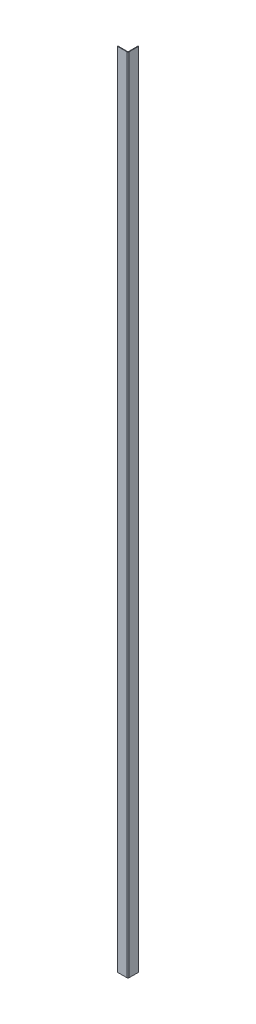
ISO-10303-21;
HEADER;
FILE_DESCRIPTION(('STEP AP214'),'2;1');
FILE_NAME('part.step','',(''),(''),'','','');
FILE_SCHEMA(('AUTOMOTIVE_DESIGN { 1 0 10303 214 1 1 1 1 }'));
ENDSEC;
DATA;
#1=APPLICATION_CONTEXT('core data for automotive mechanical design processes');
#2=APPLICATION_PROTOCOL_DEFINITION('international standard','automotive_design',2000,#1);
#3=PRODUCT_CONTEXT('',#1,'mechanical');
#4=PRODUCT('Part','Part','',(#3));
#5=PRODUCT_RELATED_PRODUCT_CATEGORY('part','',(#4));
#6=PRODUCT_DEFINITION_FORMATION('','',#4);
#7=PRODUCT_DEFINITION_CONTEXT('part definition',#1,'design');
#8=PRODUCT_DEFINITION('design','',#6,#7);
#9=PRODUCT_DEFINITION_SHAPE('','',#8);
#10=(LENGTH_UNIT() NAMED_UNIT(*) SI_UNIT(.MILLI.,.METRE.));
#11=(NAMED_UNIT(*) PLANE_ANGLE_UNIT() SI_UNIT($,.RADIAN.));
#12=(NAMED_UNIT(*) SI_UNIT($,.STERADIAN.) SOLID_ANGLE_UNIT());
#13=UNCERTAINTY_MEASURE_WITH_UNIT(LENGTH_MEASURE(1.E-05),#10,'distance_accuracy_value','');
#14=(GEOMETRIC_REPRESENTATION_CONTEXT(3) GLOBAL_UNCERTAINTY_ASSIGNED_CONTEXT((#13)) GLOBAL_UNIT_ASSIGNED_CONTEXT((#10,
#11,#12)) REPRESENTATION_CONTEXT('',''));
#15=CARTESIAN_POINT('',(0.,0.,0.));
#16=DIRECTION('',(0.,0.,1.));
#17=DIRECTION('',(1.,0.,0.));
#18=AXIS2_PLACEMENT_3D('',#15,#16,#17);
#19=CARTESIAN_POINT('',(-2.,1523.5,-20.));
#20=DIRECTION('',(0.,1.,0.));
#21=DIRECTION('',(0.,0.,1.));
#22=AXIS2_PLACEMENT_3D('',#19,#20,#21);
#23=PLANE('',#22);
#24=DIRECTION('',(0.,0.,1.));
#25=VECTOR('',#24,1.);
#26=CARTESIAN_POINT('',(-2.,1523.5,-20.));
#27=LINE('',#26,#25);
#28=CARTESIAN_POINT('',(-2.,1523.5,-20.));
#29=VERTEX_POINT('',#28);
#30=CARTESIAN_POINT('',(-1.99999999999997,1523.5,15.5));
#31=VERTEX_POINT('',#30);
#32=EDGE_CURVE('E113',#29,#31,#27,.T.);
#33=ORIENTED_EDGE('',*,*,#32,.T.);
#34=DIRECTION('',(1.,0.,0.));
#35=VECTOR('',#34,1.);
#36=CARTESIAN_POINT('',(-1.99999999999997,1523.5,15.5));
#37=LINE('',#36,#35);
#38=CARTESIAN_POINT('',(0.,1523.5,15.5));
#39=VERTEX_POINT('',#38);
#40=EDGE_CURVE('E106',#31,#39,#37,.T.);
#41=ORIENTED_EDGE('',*,*,#40,.T.);
#42=DIRECTION('',(0.,0.,1.));
#43=VECTOR('',#42,1.);
#44=CARTESIAN_POINT('',(0.,1523.5,-20.));
#45=LINE('',#44,#43);
#46=CARTESIAN_POINT('',(0.,1523.5,-20.));
#47=VERTEX_POINT('',#46);
#48=EDGE_CURVE('E99',#47,#39,#45,.T.);
#49=ORIENTED_EDGE('',*,*,#48,.F.);
#50=DIRECTION('',(1.,0.,0.));
#51=VECTOR('',#50,1.);
#52=CARTESIAN_POINT('',(-2.,1523.5,-20.));
#53=LINE('',#52,#51);
#54=EDGE_CURVE('E13',#29,#47,#53,.T.);
#55=ORIENTED_EDGE('',*,*,#54,.F.);
#56=EDGE_LOOP('',(#33,#41,#49,#55));
#57=FACE_BOUND('',#56,.T.);
#58=ADVANCED_FACE('F54',(#57),#23,.T.);
#59=CARTESIAN_POINT('',(-2.,0.,0.));
#60=DIRECTION('',(1.,0.,0.));
#61=DIRECTION('',(0.,0.,-1.));
#62=AXIS2_PLACEMENT_3D('',#59,#60,#61);
#63=PLANE('',#62);
#64=DIRECTION('',(0.,1.,0.));
#65=VECTOR('',#64,1.);
#66=CARTESIAN_POINT('',(-1.99999999999997,1523.5,15.5));
#67=LINE('',#66,#65);
#68=CARTESIAN_POINT('',(-1.99999999999997,-1523.5,15.5));
#69=VERTEX_POINT('',#68);
#70=EDGE_CURVE('E121',#31,#69,#67,.F.);
#71=ORIENTED_EDGE('',*,*,#70,.F.);
#72=ORIENTED_EDGE('',*,*,#32,.F.);
#73=DIRECTION('',(0.,1.,0.));
#74=VECTOR('',#73,1.);
#75=CARTESIAN_POINT('',(-2.,-1523.5,-20.));
#76=LINE('',#75,#74);
#77=CARTESIAN_POINT('',(-2.,-1523.5,-20.));
#78=VERTEX_POINT('',#77);
#79=EDGE_CURVE('E93',#78,#29,#76,.T.);
#80=ORIENTED_EDGE('',*,*,#79,.F.);
#81=DIRECTION('',(0.,0.,-1.));
#82=VECTOR('',#81,1.);
#83=CARTESIAN_POINT('',(-2.,-1523.5,-20.));
#84=LINE('',#83,#82);
#85=EDGE_CURVE('E107',#69,#78,#84,.T.);
#86=ORIENTED_EDGE('',*,*,#85,.F.);
#87=EDGE_LOOP('',(#71,#72,#80,#86));
#88=FACE_BOUND('',#87,.T.);
#89=ADVANCED_FACE('F222',(#88),#63,.F.);
#90=CARTESIAN_POINT('',(0.,0.,0.));
#91=DIRECTION('',(1.,0.,0.));
#92=DIRECTION('',(0.,0.,-1.));
#93=AXIS2_PLACEMENT_3D('',#90,#91,#92);
#94=PLANE('',#93);
#95=ORIENTED_EDGE('',*,*,#48,.T.);
#96=DIRECTION('',(0.,1.,0.));
#97=VECTOR('',#96,1.);
#98=CARTESIAN_POINT('',(0.,1523.5,15.5));
#99=LINE('',#98,#97);
#100=CARTESIAN_POINT('',(0.,-1523.5,15.5));
#101=VERTEX_POINT('',#100);
#102=EDGE_CURVE('E131',#39,#101,#99,.F.);
#103=ORIENTED_EDGE('',*,*,#102,.T.);
#104=DIRECTION('',(0.,0.,-1.));
#105=VECTOR('',#104,1.);
#106=CARTESIAN_POINT('',(0.,-1523.5,-20.));
#107=LINE('',#106,#105);
#108=CARTESIAN_POINT('',(0.,-1523.5,-20.));
#109=VERTEX_POINT('',#108);
#110=EDGE_CURVE('E101',#101,#109,#107,.T.);
#111=ORIENTED_EDGE('',*,*,#110,.T.);
#112=DIRECTION('',(0.,1.,0.));
#113=VECTOR('',#112,1.);
#114=CARTESIAN_POINT('',(0.,-1523.5,-20.));
#115=LINE('',#114,#113);
#116=EDGE_CURVE('E91',#109,#47,#115,.T.);
#117=ORIENTED_EDGE('',*,*,#116,.T.);
#118=EDGE_LOOP('',(#95,#103,#111,#117));
#119=FACE_BOUND('',#118,.T.);
#120=ADVANCED_FACE('F97',(#119),#94,.T.);
#121=CARTESIAN_POINT('',(-2.,-1523.5,-20.));
#122=DIRECTION('',(0.,0.,-1.));
#123=DIRECTION('',(-1.,0.,0.));
#124=AXIS2_PLACEMENT_3D('',#121,#122,#123);
#125=PLANE('',#124);
#126=ORIENTED_EDGE('',*,*,#116,.F.);
#127=DIRECTION('',(1.,0.,0.));
#128=VECTOR('',#127,1.);
#129=CARTESIAN_POINT('',(-2.,-1523.5,-20.));
#130=LINE('',#129,#128);
#131=EDGE_CURVE('E58',#78,#109,#130,.T.);
#132=ORIENTED_EDGE('',*,*,#131,.F.);
#133=ORIENTED_EDGE('',*,*,#79,.T.);
#134=ORIENTED_EDGE('',*,*,#54,.T.);
#135=EDGE_LOOP('',(#126,#132,#133,#134));
#136=FACE_BOUND('',#135,.T.);
#137=ADVANCED_FACE('F89',(#136),#125,.T.);
#138=CARTESIAN_POINT('',(-2.,-1523.5,-20.));
#139=DIRECTION('',(0.,-1.,0.));
#140=DIRECTION('',(0.,0.,-1.));
#141=AXIS2_PLACEMENT_3D('',#138,#139,#140);
#142=PLANE('',#141);
#143=DIRECTION('',(1.,0.,0.));
#144=VECTOR('',#143,1.);
#145=CARTESIAN_POINT('',(-1.99999999999997,-1523.5,15.5));
#146=LINE('',#145,#144);
#147=EDGE_CURVE('E112',#69,#101,#146,.T.);
#148=ORIENTED_EDGE('',*,*,#147,.F.);
#149=ORIENTED_EDGE('',*,*,#85,.T.);
#150=ORIENTED_EDGE('',*,*,#131,.T.);
#151=ORIENTED_EDGE('',*,*,#110,.F.);
#152=EDGE_LOOP('',(#148,#149,#150,#151));
#153=FACE_BOUND('',#152,.T.);
#154=ADVANCED_FACE('F56',(#153),#142,.T.);
#155=CARTESIAN_POINT('',(-4.49999999999997,-1523.5,15.5));
#156=DIRECTION('',(0.,-1.,0.));
#157=DIRECTION('',(0.,0.,-1.));
#158=AXIS2_PLACEMENT_3D('',#155,#156,#157);
#159=PLANE('',#158);
#160=DIRECTION('',(0.,0.,1.));
#161=VECTOR('',#160,1.);
#162=CARTESIAN_POINT('',(-4.49999999999999,-1523.5,20.0000000000001));
#163=LINE('',#162,#161);
#164=CARTESIAN_POINT('',(-4.49999999999996,-1523.5,18.));
#165=VERTEX_POINT('',#164);
#166=CARTESIAN_POINT('',(-4.49999999999996,-1523.5,20.));
#167=VERTEX_POINT('',#166);
#168=EDGE_CURVE('E134',#165,#167,#163,.T.);
#169=ORIENTED_EDGE('',*,*,#168,.F.);
#170=CARTESIAN_POINT('',(-4.49999999999997,-1523.5,15.5));
#171=DIRECTION('',(0.,1.,0.));
#172=DIRECTION('',(0.,0.,1.));
#173=AXIS2_PLACEMENT_3D('',#170,#171,#172);
#174=CIRCLE('',#173,2.5);
#175=EDGE_CURVE('E125',#69,#165,#174,.F.);
#176=ORIENTED_EDGE('',*,*,#175,.F.);
#177=ORIENTED_EDGE('',*,*,#147,.T.);
#178=CARTESIAN_POINT('',(-4.49999999999997,-1523.5,15.5));
#179=DIRECTION('',(0.,1.,0.));
#180=DIRECTION('',(0.,0.,1.));
#181=AXIS2_PLACEMENT_3D('',#178,#179,#180);
#182=CIRCLE('',#181,4.5);
#183=EDGE_CURVE('E69',#101,#167,#182,.F.);
#184=ORIENTED_EDGE('',*,*,#183,.T.);
#185=EDGE_LOOP('',(#169,#176,#177,#184));
#186=FACE_BOUND('',#185,.T.);
#187=ADVANCED_FACE('F206',(#186),#159,.T.);
#188=CARTESIAN_POINT('',(-4.49999999999997,1523.5,15.5));
#189=DIRECTION('',(0.,-1.,0.));
#190=DIRECTION('',(0.,0.,-1.));
#191=AXIS2_PLACEMENT_3D('',#188,#189,#190);
#192=PLANE('',#191);
#193=CARTESIAN_POINT('',(-4.49999999999997,1523.5,15.5));
#194=DIRECTION('',(0.,1.,0.));
#195=DIRECTION('',(0.,0.,1.));
#196=AXIS2_PLACEMENT_3D('',#193,#194,#195);
#197=CIRCLE('',#196,2.5);
#198=CARTESIAN_POINT('',(-4.49999999999996,1523.5,18.));
#199=VERTEX_POINT('',#198);
#200=EDGE_CURVE('E118',#199,#31,#197,.T.);
#201=ORIENTED_EDGE('',*,*,#200,.F.);
#202=DIRECTION('',(0.,0.,1.));
#203=VECTOR('',#202,1.);
#204=CARTESIAN_POINT('',(-4.49999999999995,1523.5,18.));
#205=LINE('',#204,#203);
#206=CARTESIAN_POINT('',(-4.49999999999995,1523.5,20.));
#207=VERTEX_POINT('',#206);
#208=EDGE_CURVE('E140',#199,#207,#205,.T.);
#209=ORIENTED_EDGE('',*,*,#208,.T.);
#210=CARTESIAN_POINT('',(-4.49999999999997,1523.5,15.5));
#211=DIRECTION('',(0.,1.,0.));
#212=DIRECTION('',(0.,0.,1.));
#213=AXIS2_PLACEMENT_3D('',#210,#211,#212);
#214=CIRCLE('',#213,4.5);
#215=EDGE_CURVE('E128',#207,#39,#214,.T.);
#216=ORIENTED_EDGE('',*,*,#215,.T.);
#217=ORIENTED_EDGE('',*,*,#40,.F.);
#218=EDGE_LOOP('',(#201,#209,#216,#217));
#219=FACE_BOUND('',#218,.T.);
#220=ADVANCED_FACE('F194',(#219),#192,.F.);
#221=CARTESIAN_POINT('',(-4.49999999999997,1523.5,15.5));
#222=DIRECTION('',(0.,1.,0.));
#223=DIRECTION('',(0.,0.,1.));
#224=AXIS2_PLACEMENT_3D('',#221,#222,#223);
#225=CYLINDRICAL_SURFACE('',#224,4.5);
#226=ORIENTED_EDGE('',*,*,#102,.F.);
#227=ORIENTED_EDGE('',*,*,#215,.F.);
#228=DIRECTION('',(0.,1.,0.));
#229=VECTOR('',#228,1.);
#230=CARTESIAN_POINT('',(-4.49999999999997,0.,20.));
#231=LINE('',#230,#229);
#232=EDGE_CURVE('E143',#167,#207,#231,.T.);
#233=ORIENTED_EDGE('',*,*,#232,.F.);
#234=ORIENTED_EDGE('',*,*,#183,.F.);
#235=EDGE_LOOP('',(#226,#227,#233,#234));
#236=FACE_BOUND('',#235,.T.);
#237=ADVANCED_FACE('F201',(#236),#225,.T.);
#238=CARTESIAN_POINT('',(-4.49999999999997,1523.5,15.5));
#239=DIRECTION('',(0.,1.,0.));
#240=DIRECTION('',(0.,0.,1.));
#241=AXIS2_PLACEMENT_3D('',#238,#239,#240);
#242=CYLINDRICAL_SURFACE('',#241,2.5);
#243=ORIENTED_EDGE('',*,*,#70,.T.);
#244=ORIENTED_EDGE('',*,*,#175,.T.);
#245=DIRECTION('',(0.,-1.,0.));
#246=VECTOR('',#245,1.);
#247=CARTESIAN_POINT('',(-4.49999999999999,-1523.5,18.));
#248=LINE('',#247,#246);
#249=EDGE_CURVE('E137',#165,#199,#248,.F.);
#250=ORIENTED_EDGE('',*,*,#249,.T.);
#251=ORIENTED_EDGE('',*,*,#200,.T.);
#252=EDGE_LOOP('',(#243,#244,#250,#251));
#253=FACE_BOUND('',#252,.T.);
#254=ADVANCED_FACE('F224',(#253),#242,.F.);
#255=CARTESIAN_POINT('',(-1.99999999999999,1523.5,20.));
#256=DIRECTION('',(0.,1.,0.));
#257=DIRECTION('',(0.,0.,1.));
#258=AXIS2_PLACEMENT_3D('',#255,#256,#257);
#259=PLANE('',#258);
#260=DIRECTION('',(1.,0.,0.));
#261=VECTOR('',#260,1.);
#262=CARTESIAN_POINT('',(-1.99999999999999,1523.5,20.));
#263=LINE('',#262,#261);
#264=CARTESIAN_POINT('',(-40.,1523.5,20.0000000000001));
#265=VERTEX_POINT('',#264);
#266=EDGE_CURVE('E161',#265,#207,#263,.T.);
#267=ORIENTED_EDGE('',*,*,#266,.T.);
#268=ORIENTED_EDGE('',*,*,#208,.F.);
#269=DIRECTION('',(-1.,0.,0.));
#270=VECTOR('',#269,1.);
#271=CARTESIAN_POINT('',(0.,1523.5,18.));
#272=LINE('',#271,#270);
#273=CARTESIAN_POINT('',(-40.,1523.5,18.0000000000001));
#274=VERTEX_POINT('',#273);
#275=EDGE_CURVE('E152',#274,#199,#272,.F.);
#276=ORIENTED_EDGE('',*,*,#275,.F.);
#277=DIRECTION('',(0.,0.,-1.));
#278=VECTOR('',#277,1.);
#279=CARTESIAN_POINT('',(-40.,1523.5,20.0000000000001));
#280=LINE('',#279,#278);
#281=EDGE_CURVE('E122',#265,#274,#280,.T.);
#282=ORIENTED_EDGE('',*,*,#281,.F.);
#283=EDGE_LOOP('',(#267,#268,#276,#282));
#284=FACE_BOUND('',#283,.T.);
#285=ADVANCED_FACE('F188',(#284),#259,.T.);
#286=CARTESIAN_POINT('',(-40.,-1523.5,20.0000000000001));
#287=DIRECTION('',(0.,-1.,0.));
#288=DIRECTION('',(0.,0.,-1.));
#289=AXIS2_PLACEMENT_3D('',#286,#287,#288);
#290=PLANE('',#289);
#291=DIRECTION('',(1.,0.,0.));
#292=VECTOR('',#291,1.);
#293=CARTESIAN_POINT('',(0.,-1523.5,18.));
#294=LINE('',#293,#292);
#295=CARTESIAN_POINT('',(-40.,-1523.5,18.0000000000001));
#296=VERTEX_POINT('',#295);
#297=EDGE_CURVE('E146',#165,#296,#294,.F.);
#298=ORIENTED_EDGE('',*,*,#297,.F.);
#299=ORIENTED_EDGE('',*,*,#168,.T.);
#300=DIRECTION('',(-1.,0.,0.));
#301=VECTOR('',#300,1.);
#302=CARTESIAN_POINT('',(-40.,-1523.5,20.0000000000001));
#303=LINE('',#302,#301);
#304=CARTESIAN_POINT('',(-40.,-1523.5,20.0000000000001));
#305=VERTEX_POINT('',#304);
#306=EDGE_CURVE('E155',#167,#305,#303,.T.);
#307=ORIENTED_EDGE('',*,*,#306,.T.);
#308=DIRECTION('',(0.,0.,-1.));
#309=VECTOR('',#308,1.);
#310=CARTESIAN_POINT('',(-40.,-1523.5,20.0000000000001));
#311=LINE('',#310,#309);
#312=EDGE_CURVE('E164',#305,#296,#311,.T.);
#313=ORIENTED_EDGE('',*,*,#312,.T.);
#314=EDGE_LOOP('',(#298,#299,#307,#313));
#315=FACE_BOUND('',#314,.T.);
#316=ADVANCED_FACE('F210',(#315),#290,.T.);
#317=CARTESIAN_POINT('',(0.,0.,20.));
#318=DIRECTION('',(0.,0.,1.));
#319=DIRECTION('',(1.,0.,0.));
#320=AXIS2_PLACEMENT_3D('',#317,#318,#319);
#321=PLANE('',#320);
#322=ORIENTED_EDGE('',*,*,#306,.F.);
#323=ORIENTED_EDGE('',*,*,#232,.T.);
#324=ORIENTED_EDGE('',*,*,#266,.F.);
#325=DIRECTION('',(0.,1.,0.));
#326=VECTOR('',#325,1.);
#327=CARTESIAN_POINT('',(-40.,1523.5,20.0000000000001));
#328=LINE('',#327,#326);
#329=EDGE_CURVE('E158',#305,#265,#328,.T.);
#330=ORIENTED_EDGE('',*,*,#329,.F.);
#331=EDGE_LOOP('',(#322,#323,#324,#330));
#332=FACE_BOUND('',#331,.T.);
#333=ADVANCED_FACE('F199',(#332),#321,.T.);
#334=CARTESIAN_POINT('',(0.,0.,18.));
#335=DIRECTION('',(0.,0.,1.));
#336=DIRECTION('',(1.,0.,0.));
#337=AXIS2_PLACEMENT_3D('',#334,#335,#336);
#338=PLANE('',#337);
#339=ORIENTED_EDGE('',*,*,#249,.F.);
#340=ORIENTED_EDGE('',*,*,#297,.T.);
#341=DIRECTION('',(0.,-1.,0.));
#342=VECTOR('',#341,1.);
#343=CARTESIAN_POINT('',(-40.,0.,18.0000000000001));
#344=LINE('',#343,#342);
#345=EDGE_CURVE('E149',#296,#274,#344,.F.);
#346=ORIENTED_EDGE('',*,*,#345,.T.);
#347=ORIENTED_EDGE('',*,*,#275,.T.);
#348=EDGE_LOOP('',(#339,#340,#346,#347));
#349=FACE_BOUND('',#348,.T.);
#350=ADVANCED_FACE('F184',(#349),#338,.F.);
#351=CARTESIAN_POINT('',(-40.,1523.5,20.0000000000001));
#352=DIRECTION('',(-1.,0.,0.));
#353=DIRECTION('',(0.,0.,1.));
#354=AXIS2_PLACEMENT_3D('',#351,#352,#353);
#355=PLANE('',#354);
#356=ORIENTED_EDGE('',*,*,#345,.F.);
#357=ORIENTED_EDGE('',*,*,#312,.F.);
#358=ORIENTED_EDGE('',*,*,#329,.T.);
#359=ORIENTED_EDGE('',*,*,#281,.T.);
#360=EDGE_LOOP('',(#356,#357,#358,#359));
#361=FACE_BOUND('',#360,.T.);
#362=ADVANCED_FACE('F172',(#361),#355,.T.);
#363=CLOSED_SHELL('',(#58,#89,#120,#137,#154,#187,#220,#237,#254,#285,#316,#333,#350,#362));
#364=MANIFOLD_SOLID_BREP('B2',#363);
#365=ADVANCED_BREP_SHAPE_REPRESENTATION('',(#18,#364),#14);
#366=SHAPE_DEFINITION_REPRESENTATION(#9,#365);
ENDSEC;
END-ISO-10303-21;
